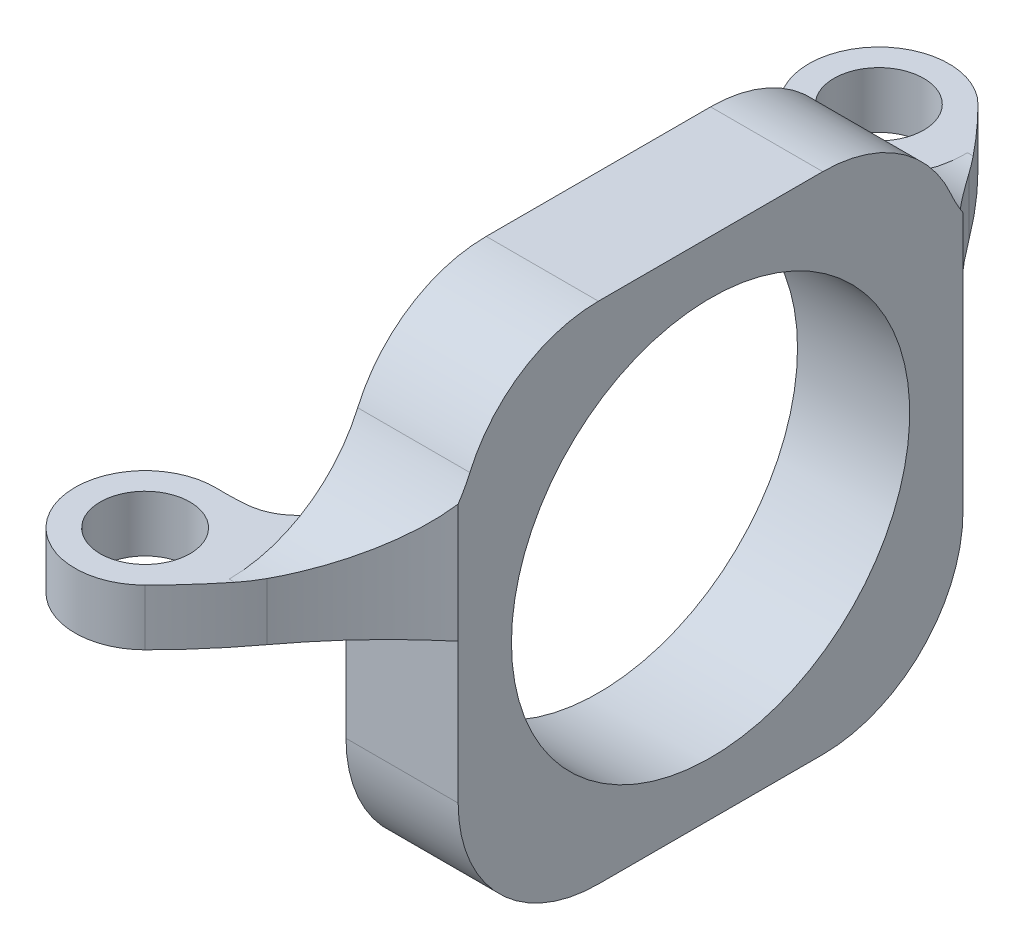
ISO-10303-21;
HEADER;
FILE_DESCRIPTION(('STEP AP214'),'2;1');
FILE_NAME('part.step','',(''),(''),'','','');
FILE_SCHEMA(('AUTOMOTIVE_DESIGN { 1 0 10303 214 1 1 1 1 }'));
ENDSEC;
DATA;
#1=APPLICATION_CONTEXT('core data for automotive mechanical design processes');
#2=APPLICATION_PROTOCOL_DEFINITION('international standard','automotive_design',2000,#1);
#3=PRODUCT_CONTEXT('',#1,'mechanical');
#4=PRODUCT('Part','Part','',(#3));
#5=PRODUCT_RELATED_PRODUCT_CATEGORY('part','',(#4));
#6=PRODUCT_DEFINITION_FORMATION('','',#4);
#7=PRODUCT_DEFINITION_CONTEXT('part definition',#1,'design');
#8=PRODUCT_DEFINITION('design','',#6,#7);
#9=PRODUCT_DEFINITION_SHAPE('','',#8);
#10=(LENGTH_UNIT() NAMED_UNIT(*) SI_UNIT(.MILLI.,.METRE.));
#11=(NAMED_UNIT(*) PLANE_ANGLE_UNIT() SI_UNIT($,.RADIAN.));
#12=(NAMED_UNIT(*) SI_UNIT($,.STERADIAN.) SOLID_ANGLE_UNIT());
#13=UNCERTAINTY_MEASURE_WITH_UNIT(LENGTH_MEASURE(1.E-05),#10,'distance_accuracy_value','');
#14=(GEOMETRIC_REPRESENTATION_CONTEXT(3) GLOBAL_UNCERTAINTY_ASSIGNED_CONTEXT((#13)) GLOBAL_UNIT_ASSIGNED_CONTEXT((#10,
#11,#12)) REPRESENTATION_CONTEXT('',''));
#15=CARTESIAN_POINT('',(0.,0.,0.));
#16=DIRECTION('',(0.,0.,1.));
#17=DIRECTION('',(1.,0.,0.));
#18=AXIS2_PLACEMENT_3D('',#15,#16,#17);
#19=CARTESIAN_POINT('',(0.,2.,8.99999999999999));
#20=DIRECTION('',(0.,0.,-1.));
#21=DIRECTION('',(-1.,0.,0.));
#22=AXIS2_PLACEMENT_3D('',#19,#20,#21);
#23=PLANE('',#22);
#24=DIRECTION('',(0.,-1.,0.));
#25=VECTOR('',#24,1.);
#26=CARTESIAN_POINT('',(20.1632298752446,2.,8.99999999999999));
#27=LINE('',#26,#25);
#28=CARTESIAN_POINT('',(20.1632298752446,0.,8.99999999999999));
#29=VERTEX_POINT('',#28);
#30=CARTESIAN_POINT('',(20.1632298752446,-5.,8.99999999999999));
#31=VERTEX_POINT('',#30);
#32=EDGE_CURVE('E274',#29,#31,#27,.T.);
#33=ORIENTED_EDGE('',*,*,#32,.F.);
#34=DIRECTION('',(1.,0.,0.));
#35=VECTOR('',#34,1.);
#36=CARTESIAN_POINT('',(0.,0.,8.99999999999999));
#37=LINE('',#36,#35);
#38=CARTESIAN_POINT('',(16.1632298752446,0.,8.99999999999999));
#39=VERTEX_POINT('',#38);
#40=EDGE_CURVE('E302',#39,#29,#37,.T.);
#41=ORIENTED_EDGE('',*,*,#40,.F.);
#42=DIRECTION('',(0.,1.,0.));
#43=VECTOR('',#42,1.);
#44=CARTESIAN_POINT('',(16.1632298752446,-10.,8.99999999999999));
#45=LINE('',#44,#43);
#46=CARTESIAN_POINT('',(16.1632298752446,-5.,8.99999999999999));
#47=VERTEX_POINT('',#46);
#48=EDGE_CURVE('E278',#47,#39,#45,.T.);
#49=ORIENTED_EDGE('',*,*,#48,.F.);
#50=DIRECTION('',(1.,0.,0.));
#51=VECTOR('',#50,1.);
#52=CARTESIAN_POINT('',(20.1632298752446,-5.,8.99999999999999));
#53=LINE('',#52,#51);
#54=EDGE_CURVE('E347',#47,#31,#53,.T.);
#55=ORIENTED_EDGE('',*,*,#54,.T.);
#56=EDGE_LOOP('',(#33,#41,#49,#55));
#57=FACE_BOUND('',#56,.T.);
#58=ADVANCED_FACE('F47',(#57),#23,.F.);
#59=CARTESIAN_POINT('',(0.,2.,-9.00000000000001));
#60=DIRECTION('',(0.,0.,-1.));
#61=DIRECTION('',(-1.,0.,0.));
#62=AXIS2_PLACEMENT_3D('',#59,#60,#61);
#63=PLANE('',#62);
#64=DIRECTION('',(-1.,0.,0.));
#65=VECTOR('',#64,1.);
#66=CARTESIAN_POINT('',(0.,0.,-9.00000000000001));
#67=LINE('',#66,#65);
#68=CARTESIAN_POINT('',(20.1632298752446,0.,-9.00000000000001));
#69=VERTEX_POINT('',#68);
#70=CARTESIAN_POINT('',(16.1632298752446,0.,-9.00000000000001));
#71=VERTEX_POINT('',#70);
#72=EDGE_CURVE('E298',#69,#71,#67,.T.);
#73=ORIENTED_EDGE('',*,*,#72,.F.);
#74=DIRECTION('',(0.,-1.,0.));
#75=VECTOR('',#74,1.);
#76=CARTESIAN_POINT('',(20.1632298752446,2.,-9.00000000000001));
#77=LINE('',#76,#75);
#78=CARTESIAN_POINT('',(20.1632298752446,-5.,-9.00000000000001));
#79=VERTEX_POINT('',#78);
#80=EDGE_CURVE('E242',#69,#79,#77,.T.);
#81=ORIENTED_EDGE('',*,*,#80,.T.);
#82=DIRECTION('',(-1.,0.,0.));
#83=VECTOR('',#82,1.);
#84=CARTESIAN_POINT('',(0.,-5.,-9.00000000000001));
#85=LINE('',#84,#83);
#86=CARTESIAN_POINT('',(16.1632298752446,-5.,-9.00000000000001));
#87=VERTEX_POINT('',#86);
#88=EDGE_CURVE('E305',#79,#87,#85,.T.);
#89=ORIENTED_EDGE('',*,*,#88,.T.);
#90=DIRECTION('',(0.,1.,0.));
#91=VECTOR('',#90,1.);
#92=CARTESIAN_POINT('',(16.1632298752446,-10.,-9.00000000000001));
#93=LINE('',#92,#91);
#94=EDGE_CURVE('E257',#87,#71,#93,.T.);
#95=ORIENTED_EDGE('',*,*,#94,.T.);
#96=EDGE_LOOP('',(#73,#81,#89,#95));
#97=FACE_BOUND('',#96,.T.);
#98=ADVANCED_FACE('F494',(#97),#63,.T.);
#99=CARTESIAN_POINT('',(0.,2.,0.));
#100=DIRECTION('',(0.,1.,0.));
#101=DIRECTION('',(0.,0.,1.));
#102=AXIS2_PLACEMENT_3D('',#99,#100,#101);
#103=PLANE('',#102);
#104=CARTESIAN_POINT('',(0.,2.,0.));
#105=DIRECTION('',(0.,1.,0.));
#106=DIRECTION('',(0.,0.,1.));
#107=AXIS2_PLACEMENT_3D('',#104,#105,#106);
#108=CIRCLE('',#107,21.);
#109=CARTESIAN_POINT('',(14.8492424049175,2.,14.8492424049175));
#110=VERTEX_POINT('',#109);
#111=CARTESIAN_POINT('',(16.3608920563858,2.,13.1651513899117));
#112=VERTEX_POINT('',#111);
#113=EDGE_CURVE('E262',#110,#112,#108,.T.);
#114=ORIENTED_EDGE('',*,*,#113,.T.);
#115=DIRECTION('',(-1.,0.,0.));
#116=VECTOR('',#115,1.);
#117=CARTESIAN_POINT('',(16.1632298752446,2.,13.1651513899117));
#118=LINE('',#117,#116);
#119=CARTESIAN_POINT('',(16.1632298752446,2.,13.1651513899117));
#120=VERTEX_POINT('',#119);
#121=EDGE_CURVE('E462',#112,#120,#118,.T.);
#122=ORIENTED_EDGE('',*,*,#121,.T.);
#123=DIRECTION('',(0.,0.,1.));
#124=VECTOR('',#123,1.);
#125=CARTESIAN_POINT('',(16.1632298752446,2.,0.));
#126=LINE('',#125,#124);
#127=CARTESIAN_POINT('',(16.1632298752446,2.,7.5915939533438));
#128=VERTEX_POINT('',#127);
#129=EDGE_CURVE('E382',#128,#120,#126,.T.);
#130=ORIENTED_EDGE('',*,*,#129,.F.);
#131=CARTESIAN_POINT('',(11.1632298752446,2.,7.5915939533438));
#132=DIRECTION('',(0.,1.,0.));
#133=DIRECTION('',(0.,0.,1.));
#134=AXIS2_PLACEMENT_3D('',#131,#132,#133);
#135=CIRCLE('',#134,5.);
#136=CARTESIAN_POINT('',(15.8940619925328,2.,9.2099967085425));
#137=VERTEX_POINT('',#136);
#138=EDGE_CURVE('E396',#128,#137,#135,.F.);
#139=ORIENTED_EDGE('',*,*,#138,.T.);
#140=CARTESIAN_POINT('',(14.0017291456175,2.,8.56263560646302));
#141=DIRECTION('',(0.,1.,0.));
#142=DIRECTION('',(0.,0.,1.));
#143=AXIS2_PLACEMENT_3D('',#140,#141,#142);
#144=CIRCLE('',#143,2.);
#145=CARTESIAN_POINT('',(14.1527478438893,2.,10.556925794167));
#146=VERTEX_POINT('',#145);
#147=EDGE_CURVE('E443',#137,#146,#144,.F.);
#148=ORIENTED_EDGE('',*,*,#147,.T.);
#149=CARTESIAN_POINT('',(13.3976543525304,2.,0.585474855647181));
#150=DIRECTION('',(0.,1.,0.));
#151=DIRECTION('',(0.,0.,1.));
#152=AXIS2_PLACEMENT_3D('',#149,#150,#151);
#153=CIRCLE('',#152,10.);
#154=CARTESIAN_POINT('',(13.144711232067,2.,10.5822753326903));
#155=VERTEX_POINT('',#154);
#156=EDGE_CURVE('E417',#146,#155,#153,.F.);
#157=ORIENTED_EDGE('',*,*,#156,.T.);
#158=CARTESIAN_POINT('',(13.0814754519511,2.,13.0814754519511));
#159=DIRECTION('',(0.,1.,0.));
#160=DIRECTION('',(0.,0.,1.));
#161=AXIS2_PLACEMENT_3D('',#158,#159,#160);
#162=CIRCLE('',#161,2.5);
#163=EDGE_CURVE('E230',#155,#110,#162,.T.);
#164=ORIENTED_EDGE('',*,*,#163,.T.);
#165=EDGE_LOOP('',(#114,#122,#130,#139,#148,#157,#164));
#166=FACE_BOUND('',#165,.T.);
#167=CARTESIAN_POINT('',(13.0814754519511,2.,13.0814754519511));
#168=DIRECTION('',(0.,1.,0.));
#169=DIRECTION('',(0.,0.,1.));
#170=AXIS2_PLACEMENT_3D('',#167,#168,#169);
#171=CIRCLE('',#170,1.6);
#172=CARTESIAN_POINT('',(13.0814754519511,2.,14.6814754519511));
#173=VERTEX_POINT('',#172);
#174=EDGE_CURVE('E266',#173,#173,#171,.T.);
#175=ORIENTED_EDGE('',*,*,#174,.F.);
#176=EDGE_LOOP('',(#175));
#177=FACE_BOUND('',#176,.T.);
#178=ADVANCED_FACE('F497',(#166,#177),#103,.T.);
#179=CARTESIAN_POINT('',(0.,0.,0.));
#180=DIRECTION('',(0.,1.,0.));
#181=DIRECTION('',(0.,0.,1.));
#182=AXIS2_PLACEMENT_3D('',#179,#180,#181);
#183=PLANE('',#182);
#184=CARTESIAN_POINT('',(13.0814754519511,0.,13.0814754519511));
#185=DIRECTION('',(0.,1.,0.));
#186=DIRECTION('',(0.,0.,1.));
#187=AXIS2_PLACEMENT_3D('',#184,#185,#186);
#188=CIRCLE('',#187,1.6);
#189=CARTESIAN_POINT('',(13.0814754519511,0.,14.6814754519511));
#190=VERTEX_POINT('',#189);
#191=EDGE_CURVE('E254',#190,#190,#188,.T.);
#192=ORIENTED_EDGE('',*,*,#191,.T.);
#193=EDGE_LOOP('',(#192));
#194=FACE_BOUND('',#193,.T.);
#195=CARTESIAN_POINT('',(13.0814754519511,0.,13.0814754519511));
#196=DIRECTION('',(0.,1.,0.));
#197=DIRECTION('',(0.,0.,1.));
#198=AXIS2_PLACEMENT_3D('',#195,#196,#197);
#199=CIRCLE('',#198,2.5);
#200=CARTESIAN_POINT('',(13.144711232067,0.,10.5822753326903));
#201=VERTEX_POINT('',#200);
#202=CARTESIAN_POINT('',(14.8492424049175,0.,14.8492424049175));
#203=VERTEX_POINT('',#202);
#204=EDGE_CURVE('E281',#201,#203,#199,.T.);
#205=ORIENTED_EDGE('',*,*,#204,.F.);
#206=CARTESIAN_POINT('',(13.3976543525304,0.,0.585474855647181));
#207=DIRECTION('',(0.,1.,0.));
#208=DIRECTION('',(0.,0.,1.));
#209=AXIS2_PLACEMENT_3D('',#206,#207,#208);
#210=CIRCLE('',#209,10.);
#211=CARTESIAN_POINT('',(14.1527478438893,0.,10.556925794167));
#212=VERTEX_POINT('',#211);
#213=EDGE_CURVE('E413',#201,#212,#210,.T.);
#214=ORIENTED_EDGE('',*,*,#213,.T.);
#215=CARTESIAN_POINT('',(14.0017291456175,0.,8.56263560646302));
#216=DIRECTION('',(0.,1.,0.));
#217=DIRECTION('',(0.,0.,1.));
#218=AXIS2_PLACEMENT_3D('',#215,#216,#217);
#219=CIRCLE('',#218,2.);
#220=CARTESIAN_POINT('',(15.8940619925328,0.,9.2099967085425));
#221=VERTEX_POINT('',#220);
#222=EDGE_CURVE('E440',#212,#221,#219,.T.);
#223=ORIENTED_EDGE('',*,*,#222,.T.);
#224=CARTESIAN_POINT('',(11.1632298752446,0.,7.5915939533438));
#225=DIRECTION('',(0.,1.,0.));
#226=DIRECTION('',(0.,0.,1.));
#227=AXIS2_PLACEMENT_3D('',#224,#225,#226);
#228=CIRCLE('',#227,5.);
#229=CARTESIAN_POINT('',(16.1632298752446,0.,7.5915939533438));
#230=VERTEX_POINT('',#229);
#231=EDGE_CURVE('E393',#221,#230,#228,.T.);
#232=ORIENTED_EDGE('',*,*,#231,.T.);
#233=DIRECTION('',(0.,0.,-1.));
#234=VECTOR('',#233,1.);
#235=CARTESIAN_POINT('',(16.1632298752446,0.,0.));
#236=LINE('',#235,#234);
#237=EDGE_CURVE('E389',#39,#230,#236,.T.);
#238=ORIENTED_EDGE('',*,*,#237,.F.);
#239=ORIENTED_EDGE('',*,*,#40,.T.);
#240=CARTESIAN_POINT('',(33.7226109756454,0.,25.0356847117326));
#241=DIRECTION('',(0.,1.,0.));
#242=DIRECTION('',(0.,0.,1.));
#243=AXIS2_PLACEMENT_3D('',#240,#241,#242);
#244=CIRCLE('',#243,21.);
#245=CARTESIAN_POINT('',(16.8613054878227,0.,12.5178423558663));
#246=VERTEX_POINT('',#245);
#247=EDGE_CURVE('E368',#29,#246,#244,.T.);
#248=ORIENTED_EDGE('',*,*,#247,.T.);
#249=CARTESIAN_POINT('',(0.,0.,0.));
#250=DIRECTION('',(0.,1.,0.));
#251=DIRECTION('',(0.,0.,1.));
#252=AXIS2_PLACEMENT_3D('',#249,#250,#251);
#253=CIRCLE('',#252,21.);
#254=EDGE_CURVE('E284',#203,#246,#253,.T.);
#255=ORIENTED_EDGE('',*,*,#254,.F.);
#256=EDGE_LOOP('',(#205,#214,#223,#232,#238,#239,#248,#255));
#257=FACE_BOUND('',#256,.T.);
#258=ADVANCED_FACE('F492',(#194,#257),#183,.F.);
#259=CARTESIAN_POINT('',(0.,2.,0.));
#260=DIRECTION('',(0.,-1.,0.));
#261=DIRECTION('',(0.,0.,-1.));
#262=AXIS2_PLACEMENT_3D('',#259,#260,#261);
#263=CYLINDRICAL_SURFACE('',#262,21.);
#264=CARTESIAN_POINT('',(0.,2.,0.));
#265=DIRECTION('',(0.,1.,0.));
#266=DIRECTION('',(0.,0.,1.));
#267=AXIS2_PLACEMENT_3D('',#264,#265,#266);
#268=CIRCLE('',#267,21.);
#269=CARTESIAN_POINT('',(14.8492424049175,2.,-14.8492424049175));
#270=VERTEX_POINT('',#269);
#271=CARTESIAN_POINT('',(16.3608920563857,2.,-13.1651513899117));
#272=VERTEX_POINT('',#271);
#273=EDGE_CURVE('E231',#270,#272,#268,.F.);
#274=ORIENTED_EDGE('',*,*,#273,.T.);
#275=CARTESIAN_POINT('',(16.3608920563857,2.,-13.1651513899117));
#276=CARTESIAN_POINT('',(16.4037309745653,2.00000007852321,-13.1119141365129));
#277=CARTESIAN_POINT('',(16.4463102428086,2.00085027696003,-13.0584665663315));
#278=CARTESIAN_POINT('',(16.5308853952596,2.00429030590994,-12.9512348517216));
#279=CARTESIAN_POINT('',(16.5728817062718,2.00687878683591,-12.8974510004477));
#280=CARTESIAN_POINT('',(16.6562937386516,2.01383467620823,-12.7895476418713));
#281=CARTESIAN_POINT('',(16.6977094552945,2.01820209912243,-12.7354281318426));
#282=CARTESIAN_POINT('',(16.7799599052771,2.02876080415639,-12.6268598996597));
#283=CARTESIAN_POINT('',(16.820794162765,2.03495349915541,-12.5724109546002));
#284=CARTESIAN_POINT('',(16.8613054878227,2.04207795397677,-12.5178423558663));
#285=B_SPLINE_CURVE_WITH_KNOTS('',3,(#275,#276,#277,#278,#279,#280,#281,#282,#283,#284),
.UNSPECIFIED.,.F.,.F.,(4,2,2,2,4),(0.,0.204993994830634,0.409829017862656,0.6146657068175,
0.81966137096516),.UNSPECIFIED.);
#286=CARTESIAN_POINT('',(16.8613054878227,2.04207795397677,-12.5178423558663));
#287=VERTEX_POINT('',#286);
#288=EDGE_CURVE('E470',#272,#287,#285,.T.);
#289=ORIENTED_EDGE('',*,*,#288,.T.);
#290=DIRECTION('',(0.,-1.,0.));
#291=VECTOR('',#290,1.);
#292=CARTESIAN_POINT('',(16.8613054878227,2.,-12.5178423558663));
#293=LINE('',#292,#291);
#294=CARTESIAN_POINT('',(16.8613054878227,0.,-12.5178423558663));
#295=VERTEX_POINT('',#294);
#296=EDGE_CURVE('E359',#287,#295,#293,.T.);
#297=ORIENTED_EDGE('',*,*,#296,.T.);
#298=CARTESIAN_POINT('',(0.,0.,0.));
#299=DIRECTION('',(0.,1.,0.));
#300=DIRECTION('',(0.,0.,1.));
#301=AXIS2_PLACEMENT_3D('',#298,#299,#300);
#302=CIRCLE('',#301,21.);
#303=CARTESIAN_POINT('',(14.8492424049175,0.,-14.8492424049175));
#304=VERTEX_POINT('',#303);
#305=EDGE_CURVE('E240',#304,#295,#302,.F.);
#306=ORIENTED_EDGE('',*,*,#305,.F.);
#307=DIRECTION('',(0.,-1.,0.));
#308=VECTOR('',#307,1.);
#309=CARTESIAN_POINT('',(14.8492424049175,2.,-14.8492424049175));
#310=LINE('',#309,#308);
#311=EDGE_CURVE('E221',#270,#304,#310,.T.);
#312=ORIENTED_EDGE('',*,*,#311,.F.);
#313=EDGE_LOOP('',(#274,#289,#297,#306,#312));
#314=FACE_BOUND('',#313,.T.);
#315=ADVANCED_FACE('F235',(#314),#263,.T.);
#316=CARTESIAN_POINT('',(13.0814754519511,2.,-13.0814754519511));
#317=DIRECTION('',(0.,-1.,0.));
#318=DIRECTION('',(0.,0.,-1.));
#319=AXIS2_PLACEMENT_3D('',#316,#317,#318);
#320=CYLINDRICAL_SURFACE('',#319,2.5);
#321=CARTESIAN_POINT('',(13.0814754519511,0.,-13.0814754519511));
#322=DIRECTION('',(0.,1.,0.));
#323=DIRECTION('',(0.,0.,1.));
#324=AXIS2_PLACEMENT_3D('',#321,#322,#323);
#325=CIRCLE('',#324,2.5);
#326=CARTESIAN_POINT('',(13.144711232067,0.,-10.5822753326903));
#327=VERTEX_POINT('',#326);
#328=EDGE_CURVE('E277',#327,#304,#325,.F.);
#329=ORIENTED_EDGE('',*,*,#328,.F.);
#330=DIRECTION('',(0.,-1.,0.));
#331=VECTOR('',#330,1.);
#332=CARTESIAN_POINT('',(13.144711232067,2.,-10.5822753326903));
#333=LINE('',#332,#331);
#334=CARTESIAN_POINT('',(13.144711232067,2.,-10.5822753326903));
#335=VERTEX_POINT('',#334);
#336=EDGE_CURVE('E224',#327,#335,#333,.F.);
#337=ORIENTED_EDGE('',*,*,#336,.T.);
#338=CARTESIAN_POINT('',(13.0814754519511,2.,-13.0814754519511));
#339=DIRECTION('',(0.,1.,0.));
#340=DIRECTION('',(0.,0.,1.));
#341=AXIS2_PLACEMENT_3D('',#338,#339,#340);
#342=CIRCLE('',#341,2.5);
#343=EDGE_CURVE('E217',#335,#270,#342,.F.);
#344=ORIENTED_EDGE('',*,*,#343,.T.);
#345=ORIENTED_EDGE('',*,*,#311,.T.);
#346=EDGE_LOOP('',(#329,#337,#344,#345));
#347=FACE_BOUND('',#346,.T.);
#348=ADVANCED_FACE('F220',(#347),#320,.T.);
#349=CARTESIAN_POINT('',(16.1632298752446,2.,0.));
#350=DIRECTION('',(1.,0.,0.));
#351=DIRECTION('',(0.,0.,-1.));
#352=AXIS2_PLACEMENT_3D('',#349,#350,#351);
#353=PLANE('',#352);
#354=CARTESIAN_POINT('',(16.1632298752446,-1.,0.));
#355=DIRECTION('',(1.,0.,0.));
#356=DIRECTION('',(0.,0.,-1.));
#357=AXIS2_PLACEMENT_3D('',#354,#355,#356);
#358=CIRCLE('',#357,7.1);
#359=CARTESIAN_POINT('',(16.1632298752446,-1.,-7.1));
#360=VERTEX_POINT('',#359);
#361=EDGE_CURVE('E310',#360,#360,#358,.F.);
#362=ORIENTED_EDGE('',*,*,#361,.F.);
#363=EDGE_LOOP('',(#362));
#364=FACE_BOUND('',#363,.T.);
#365=ORIENTED_EDGE('',*,*,#48,.T.);
#366=ORIENTED_EDGE('',*,*,#237,.T.);
#367=DIRECTION('',(0.,1.,0.));
#368=VECTOR('',#367,1.);
#369=CARTESIAN_POINT('',(16.1632298752446,2.,7.5915939533438));
#370=LINE('',#369,#368);
#371=EDGE_CURVE('E385',#230,#128,#370,.T.);
#372=ORIENTED_EDGE('',*,*,#371,.T.);
#373=ORIENTED_EDGE('',*,*,#129,.T.);
#374=CARTESIAN_POINT('',(16.1632298752446,7.,13.1651513899117));
#375=DIRECTION('',(1.,0.,0.));
#376=DIRECTION('',(0.,0.,-1.));
#377=AXIS2_PLACEMENT_3D('',#374,#375,#376);
#378=CIRCLE('',#377,5.);
#379=CARTESIAN_POINT('',(16.1632298752446,5.,8.58257569495583));
#380=VERTEX_POINT('',#379);
#381=EDGE_CURVE('E11',#120,#380,#378,.T.);
#382=ORIENTED_EDGE('',*,*,#381,.T.);
#383=CARTESIAN_POINT('',(16.1632298752446,3.,3.99999999999999));
#384=DIRECTION('',(1.,0.,0.));
#385=DIRECTION('',(0.,0.,-1.));
#386=AXIS2_PLACEMENT_3D('',#383,#384,#385);
#387=CIRCLE('',#386,5.);
#388=CARTESIAN_POINT('',(16.1632298752446,8.,3.99999999999999));
#389=VERTEX_POINT('',#388);
#390=EDGE_CURVE('E314',#380,#389,#387,.F.);
#391=ORIENTED_EDGE('',*,*,#390,.T.);
#392=DIRECTION('',(0.,0.,1.));
#393=VECTOR('',#392,1.);
#394=CARTESIAN_POINT('',(16.1632298752446,8.,-9.00000000000001));
#395=LINE('',#394,#393);
#396=CARTESIAN_POINT('',(16.1632298752446,8.,-4.));
#397=VERTEX_POINT('',#396);
#398=EDGE_CURVE('E593',#397,#389,#395,.T.);
#399=ORIENTED_EDGE('',*,*,#398,.F.);
#400=CARTESIAN_POINT('',(16.1632298752446,3.,-4.));
#401=DIRECTION('',(1.,0.,0.));
#402=DIRECTION('',(0.,0.,-1.));
#403=AXIS2_PLACEMENT_3D('',#400,#401,#402);
#404=CIRCLE('',#403,5.);
#405=CARTESIAN_POINT('',(16.1632298752446,5.,-8.58257569495584));
#406=VERTEX_POINT('',#405);
#407=EDGE_CURVE('E317',#397,#406,#404,.F.);
#408=ORIENTED_EDGE('',*,*,#407,.T.);
#409=CARTESIAN_POINT('',(16.1632298752446,7.,-13.1651513899117));
#410=DIRECTION('',(1.,0.,0.));
#411=DIRECTION('',(0.,0.,-1.));
#412=AXIS2_PLACEMENT_3D('',#409,#410,#411);
#413=CIRCLE('',#412,5.);
#414=CARTESIAN_POINT('',(16.1632298752446,2.,-13.1651513899117));
#415=VERTEX_POINT('',#414);
#416=EDGE_CURVE('E466',#406,#415,#413,.T.);
#417=ORIENTED_EDGE('',*,*,#416,.T.);
#418=DIRECTION('',(0.,0.,1.));
#419=VECTOR('',#418,1.);
#420=CARTESIAN_POINT('',(16.1632298752446,2.,0.));
#421=LINE('',#420,#419);
#422=CARTESIAN_POINT('',(16.1632298752446,2.,-7.5915939533438));
#423=VERTEX_POINT('',#422);
#424=EDGE_CURVE('E371',#415,#423,#421,.T.);
#425=ORIENTED_EDGE('',*,*,#424,.T.);
#426=DIRECTION('',(0.,1.,0.));
#427=VECTOR('',#426,1.);
#428=CARTESIAN_POINT('',(16.1632298752446,0.,-7.5915939533438));
#429=LINE('',#428,#427);
#430=CARTESIAN_POINT('',(16.1632298752446,0.,-7.5915939533438));
#431=VERTEX_POINT('',#430);
#432=EDGE_CURVE('E375',#423,#431,#429,.F.);
#433=ORIENTED_EDGE('',*,*,#432,.T.);
#434=DIRECTION('',(0.,0.,-1.));
#435=VECTOR('',#434,1.);
#436=CARTESIAN_POINT('',(16.1632298752446,0.,0.));
#437=LINE('',#436,#435);
#438=EDGE_CURVE('E379',#431,#71,#437,.T.);
#439=ORIENTED_EDGE('',*,*,#438,.T.);
#440=ORIENTED_EDGE('',*,*,#94,.F.);
#441=CARTESIAN_POINT('',(16.1632298752446,-5.,-4.));
#442=DIRECTION('',(1.,0.,0.));
#443=DIRECTION('',(0.,0.,-1.));
#444=AXIS2_PLACEMENT_3D('',#441,#442,#443);
#445=CIRCLE('',#444,5.);
#446=CARTESIAN_POINT('',(16.1632298752446,-10.,-4.));
#447=VERTEX_POINT('',#446);
#448=EDGE_CURVE('E324',#87,#447,#445,.F.);
#449=ORIENTED_EDGE('',*,*,#448,.T.);
#450=DIRECTION('',(0.,0.,1.));
#451=VECTOR('',#450,1.);
#452=CARTESIAN_POINT('',(16.1632298752446,-10.,-9.00000000000001));
#453=LINE('',#452,#451);
#454=CARTESIAN_POINT('',(16.1632298752446,-10.,3.99999999999999));
#455=VERTEX_POINT('',#454);
#456=EDGE_CURVE('E609',#447,#455,#453,.T.);
#457=ORIENTED_EDGE('',*,*,#456,.T.);
#458=CARTESIAN_POINT('',(16.1632298752446,-5.,3.99999999999999));
#459=DIRECTION('',(1.,0.,0.));
#460=DIRECTION('',(0.,0.,-1.));
#461=AXIS2_PLACEMENT_3D('',#458,#459,#460);
#462=CIRCLE('',#461,5.);
#463=EDGE_CURVE('E321',#455,#47,#462,.F.);
#464=ORIENTED_EDGE('',*,*,#463,.T.);
#465=EDGE_LOOP('',(#365,#366,#372,#373,#382,#391,#399,#408,#417,#425,#433,#439,#440,#449,#457,#464));
#466=FACE_BOUND('',#465,.T.);
#467=ADVANCED_FACE('F550',(#364,#466),#353,.F.);
#468=CARTESIAN_POINT('',(13.0814754519511,2.,13.0814754519511));
#469=DIRECTION('',(0.,-1.,0.));
#470=DIRECTION('',(0.,0.,-1.));
#471=AXIS2_PLACEMENT_3D('',#468,#469,#470);
#472=CYLINDRICAL_SURFACE('',#471,2.5);
#473=ORIENTED_EDGE('',*,*,#163,.F.);
#474=DIRECTION('',(0.,-1.,0.));
#475=VECTOR('',#474,1.);
#476=CARTESIAN_POINT('',(13.144711232067,2.,10.5822753326903));
#477=LINE('',#476,#475);
#478=EDGE_CURVE('E407',#155,#201,#477,.T.);
#479=ORIENTED_EDGE('',*,*,#478,.T.);
#480=ORIENTED_EDGE('',*,*,#204,.T.);
#481=DIRECTION('',(0.,-1.,0.));
#482=VECTOR('',#481,1.);
#483=CARTESIAN_POINT('',(14.8492424049175,2.,14.8492424049175));
#484=LINE('',#483,#482);
#485=EDGE_CURVE('E243',#110,#203,#484,.T.);
#486=ORIENTED_EDGE('',*,*,#485,.F.);
#487=EDGE_LOOP('',(#473,#479,#480,#486));
#488=FACE_BOUND('',#487,.T.);
#489=ADVANCED_FACE('F547',(#488),#472,.T.);
#490=CARTESIAN_POINT('',(0.,2.,0.));
#491=DIRECTION('',(0.,-1.,0.));
#492=DIRECTION('',(0.,0.,-1.));
#493=AXIS2_PLACEMENT_3D('',#490,#491,#492);
#494=CYLINDRICAL_SURFACE('',#493,21.);
#495=ORIENTED_EDGE('',*,*,#254,.T.);
#496=DIRECTION('',(0.,-1.,0.));
#497=VECTOR('',#496,1.);
#498=CARTESIAN_POINT('',(16.8613054878227,2.,12.5178423558663));
#499=LINE('',#498,#497);
#500=CARTESIAN_POINT('',(16.8613054878227,2.04207795397677,12.5178423558663));
#501=VERTEX_POINT('',#500);
#502=EDGE_CURVE('E72',#246,#501,#499,.F.);
#503=ORIENTED_EDGE('',*,*,#502,.T.);
#504=CARTESIAN_POINT('',(16.8613054878227,2.04207795397677,12.5178423558663));
#505=CARTESIAN_POINT('',(16.820794162765,2.03495349915541,12.5724109546002));
#506=CARTESIAN_POINT('',(16.7799599052771,2.02876080415639,12.6268598996597));
#507=CARTESIAN_POINT('',(16.6977094552945,2.01820209912243,12.7354281318426));
#508=CARTESIAN_POINT('',(16.6562937386516,2.01383467620823,12.7895476418713));
#509=CARTESIAN_POINT('',(16.5728817062718,2.00687878683591,12.8974510004477));
#510=CARTESIAN_POINT('',(16.5308853952596,2.00429030590994,12.9512348517216));
#511=CARTESIAN_POINT('',(16.4463102428086,2.00085027696003,13.0584665663315));
#512=CARTESIAN_POINT('',(16.4037309745653,2.00000007852321,13.1119141365129));
#513=CARTESIAN_POINT('',(16.3608920563858,2.,13.1651513899117));
#514=B_SPLINE_CURVE_WITH_KNOTS('',3,(#504,#505,#506,#507,#508,#509,#510,#511,#512,#513),
.UNSPECIFIED.,.F.,.F.,(4,2,2,2,4),(0.,0.204995664147657,0.409832353102499,0.614667376134519,
0.819661370965151),.UNSPECIFIED.);
#515=EDGE_CURVE('E57',#501,#112,#514,.T.);
#516=ORIENTED_EDGE('',*,*,#515,.T.);
#517=ORIENTED_EDGE('',*,*,#113,.F.);
#518=ORIENTED_EDGE('',*,*,#485,.T.);
#519=EDGE_LOOP('',(#495,#503,#516,#517,#518));
#520=FACE_BOUND('',#519,.T.);
#521=ADVANCED_FACE('F541',(#520),#494,.T.);
#522=CARTESIAN_POINT('',(13.0814754519511,2.,13.0814754519511));
#523=DIRECTION('',(0.,-1.,0.));
#524=DIRECTION('',(0.,0.,-1.));
#525=AXIS2_PLACEMENT_3D('',#522,#523,#524);
#526=CYLINDRICAL_SURFACE('',#525,1.6);
#527=ORIENTED_EDGE('',*,*,#174,.T.);
#528=EDGE_LOOP('',(#527));
#529=FACE_BOUND('',#528,.T.);
#530=ORIENTED_EDGE('',*,*,#191,.F.);
#531=EDGE_LOOP('',(#530));
#532=FACE_BOUND('',#531,.T.);
#533=ADVANCED_FACE('F546',(#529,#532),#526,.F.);
#534=CARTESIAN_POINT('',(20.1632298752446,2.,0.));
#535=DIRECTION('',(-1.,0.,0.));
#536=DIRECTION('',(0.,0.,1.));
#537=AXIS2_PLACEMENT_3D('',#534,#535,#536);
#538=PLANE('',#537);
#539=CARTESIAN_POINT('',(20.1632298752446,-1.,0.));
#540=DIRECTION('',(-1.,0.,0.));
#541=DIRECTION('',(0.,0.,1.));
#542=AXIS2_PLACEMENT_3D('',#539,#540,#541);
#543=CIRCLE('',#542,7.1);
#544=CARTESIAN_POINT('',(20.1632298752446,-1.,7.1));
#545=VERTEX_POINT('',#544);
#546=EDGE_CURVE('E306',#545,#545,#543,.F.);
#547=ORIENTED_EDGE('',*,*,#546,.F.);
#548=EDGE_LOOP('',(#547));
#549=FACE_BOUND('',#548,.T.);
#550=DIRECTION('',(0.,0.,-1.));
#551=VECTOR('',#550,1.);
#552=CARTESIAN_POINT('',(20.1632298752446,-10.,-9.00000000000001));
#553=LINE('',#552,#551);
#554=CARTESIAN_POINT('',(20.1632298752446,-10.,3.99999999999999));
#555=VERTEX_POINT('',#554);
#556=CARTESIAN_POINT('',(20.1632298752446,-10.,-4.));
#557=VERTEX_POINT('',#556);
#558=EDGE_CURVE('E602',#555,#557,#553,.T.);
#559=ORIENTED_EDGE('',*,*,#558,.T.);
#560=CARTESIAN_POINT('',(20.1632298752446,-5.,-4.));
#561=DIRECTION('',(-1.,0.,0.));
#562=DIRECTION('',(0.,0.,1.));
#563=AXIS2_PLACEMENT_3D('',#560,#561,#562);
#564=CIRCLE('',#563,5.);
#565=EDGE_CURVE('E343',#557,#79,#564,.F.);
#566=ORIENTED_EDGE('',*,*,#565,.T.);
#567=ORIENTED_EDGE('',*,*,#80,.F.);
#568=CARTESIAN_POINT('',(20.1632298752446,4.23386300065923,-9.00000000000001));
#569=VERTEX_POINT('',#568);
#570=EDGE_CURVE('E297',#569,#69,#77,.T.);
#571=ORIENTED_EDGE('',*,*,#570,.F.);
#572=CARTESIAN_POINT('',(20.1632298752446,7.,-13.1651513899117));
#573=DIRECTION('',(-1.,0.,0.));
#574=DIRECTION('',(0.,0.,1.));
#575=AXIS2_PLACEMENT_3D('',#572,#573,#574);
#576=CIRCLE('',#575,5.);
#577=CARTESIAN_POINT('',(20.1632298752446,5.,-8.58257569495584));
#578=VERTEX_POINT('',#577);
#579=EDGE_CURVE('E578',#569,#578,#576,.T.);
#580=ORIENTED_EDGE('',*,*,#579,.T.);
#581=CARTESIAN_POINT('',(20.1632298752446,3.,-4.));
#582=DIRECTION('',(-1.,0.,0.));
#583=DIRECTION('',(0.,0.,1.));
#584=AXIS2_PLACEMENT_3D('',#581,#582,#583);
#585=CIRCLE('',#584,5.);
#586=CARTESIAN_POINT('',(20.1632298752446,8.,-4.));
#587=VERTEX_POINT('',#586);
#588=EDGE_CURVE('E337',#578,#587,#585,.F.);
#589=ORIENTED_EDGE('',*,*,#588,.T.);
#590=DIRECTION('',(0.,0.,-1.));
#591=VECTOR('',#590,1.);
#592=CARTESIAN_POINT('',(20.1632298752446,8.,-9.00000000000001));
#593=LINE('',#592,#591);
#594=CARTESIAN_POINT('',(20.1632298752446,8.,3.99999999999999));
#595=VERTEX_POINT('',#594);
#596=EDGE_CURVE('E597',#595,#587,#593,.T.);
#597=ORIENTED_EDGE('',*,*,#596,.F.);
#598=CARTESIAN_POINT('',(20.1632298752446,3.,3.99999999999999));
#599=DIRECTION('',(-1.,0.,0.));
#600=DIRECTION('',(0.,0.,1.));
#601=AXIS2_PLACEMENT_3D('',#598,#599,#600);
#602=CIRCLE('',#601,5.);
#603=CARTESIAN_POINT('',(20.1632298752446,5.,8.58257569495583));
#604=VERTEX_POINT('',#603);
#605=EDGE_CURVE('E333',#595,#604,#602,.F.);
#606=ORIENTED_EDGE('',*,*,#605,.T.);
#607=CARTESIAN_POINT('',(20.1632298752446,7.,13.1651513899117));
#608=DIRECTION('',(-1.,0.,0.));
#609=DIRECTION('',(0.,0.,1.));
#610=AXIS2_PLACEMENT_3D('',#607,#608,#609);
#611=CIRCLE('',#610,5.);
#612=CARTESIAN_POINT('',(20.1632298752446,4.23386300065923,8.99999999999999));
#613=VERTEX_POINT('',#612);
#614=EDGE_CURVE('E534',#604,#613,#611,.T.);
#615=ORIENTED_EDGE('',*,*,#614,.T.);
#616=EDGE_CURVE('E64',#613,#29,#27,.T.);
#617=ORIENTED_EDGE('',*,*,#616,.T.);
#618=ORIENTED_EDGE('',*,*,#32,.T.);
#619=CARTESIAN_POINT('',(20.1632298752446,-5.,3.99999999999999));
#620=DIRECTION('',(-1.,0.,0.));
#621=DIRECTION('',(0.,0.,1.));
#622=AXIS2_PLACEMENT_3D('',#619,#620,#621);
#623=CIRCLE('',#622,5.);
#624=EDGE_CURVE('E340',#31,#555,#623,.F.);
#625=ORIENTED_EDGE('',*,*,#624,.T.);
#626=EDGE_LOOP('',(#559,#566,#567,#571,#580,#589,#597,#606,#615,#617,#618,#625));
#627=FACE_BOUND('',#626,.T.);
#628=ADVANCED_FACE('F570',(#549,#627),#538,.F.);
#629=CARTESIAN_POINT('',(13.0814754519511,2.,-13.0814754519511));
#630=DIRECTION('',(0.,-1.,0.));
#631=DIRECTION('',(0.,0.,-1.));
#632=AXIS2_PLACEMENT_3D('',#629,#630,#631);
#633=CYLINDRICAL_SURFACE('',#632,1.6);
#634=CARTESIAN_POINT('',(13.0814754519511,2.,-13.0814754519511));
#635=DIRECTION('',(0.,1.,0.));
#636=DIRECTION('',(0.,0.,1.));
#637=AXIS2_PLACEMENT_3D('',#634,#635,#636);
#638=CIRCLE('',#637,1.6);
#639=CARTESIAN_POINT('',(13.0814754519511,2.,-11.4814754519511));
#640=VERTEX_POINT('',#639);
#641=EDGE_CURVE('E270',#640,#640,#638,.T.);
#642=ORIENTED_EDGE('',*,*,#641,.T.);
#643=EDGE_LOOP('',(#642));
#644=FACE_BOUND('',#643,.T.);
#645=CARTESIAN_POINT('',(13.0814754519511,0.,-13.0814754519511));
#646=DIRECTION('',(0.,1.,0.));
#647=DIRECTION('',(0.,0.,1.));
#648=AXIS2_PLACEMENT_3D('',#645,#646,#647);
#649=CIRCLE('',#648,1.6);
#650=CARTESIAN_POINT('',(13.0814754519511,0.,-11.4814754519511));
#651=VERTEX_POINT('',#650);
#652=EDGE_CURVE('E250',#651,#651,#649,.T.);
#653=ORIENTED_EDGE('',*,*,#652,.F.);
#654=EDGE_LOOP('',(#653));
#655=FACE_BOUND('',#654,.T.);
#656=ADVANCED_FACE('F641',(#644,#655),#633,.F.);
#657=ORIENTED_EDGE('',*,*,#424,.F.);
#658=DIRECTION('',(-1.,0.,0.));
#659=VECTOR('',#658,1.);
#660=CARTESIAN_POINT('',(20.1632298752446,2.,-13.1651513899117));
#661=LINE('',#660,#659);
#662=EDGE_CURVE('E248',#415,#272,#661,.F.);
#663=ORIENTED_EDGE('',*,*,#662,.T.);
#664=ORIENTED_EDGE('',*,*,#273,.F.);
#665=ORIENTED_EDGE('',*,*,#343,.F.);
#666=CARTESIAN_POINT('',(13.3976543525304,2.,-0.585474855647181));
#667=DIRECTION('',(0.,1.,0.));
#668=DIRECTION('',(0.,0.,1.));
#669=AXIS2_PLACEMENT_3D('',#666,#667,#668);
#670=CIRCLE('',#669,10.);
#671=CARTESIAN_POINT('',(14.1527478438893,2.,-10.556925794167));
#672=VERTEX_POINT('',#671);
#673=EDGE_CURVE('E423',#335,#672,#670,.F.);
#674=ORIENTED_EDGE('',*,*,#673,.T.);
#675=CARTESIAN_POINT('',(14.0017291456175,2.,-8.56263560646302));
#676=DIRECTION('',(0.,1.,0.));
#677=DIRECTION('',(0.,0.,1.));
#678=AXIS2_PLACEMENT_3D('',#675,#676,#677);
#679=CIRCLE('',#678,2.);
#680=CARTESIAN_POINT('',(15.8940619925328,2.,-9.2099967085425));
#681=VERTEX_POINT('',#680);
#682=EDGE_CURVE('E446',#672,#681,#679,.F.);
#683=ORIENTED_EDGE('',*,*,#682,.T.);
#684=CARTESIAN_POINT('',(11.1632298752446,2.,-7.5915939533438));
#685=DIRECTION('',(0.,1.,0.));
#686=DIRECTION('',(0.,0.,1.));
#687=AXIS2_PLACEMENT_3D('',#684,#685,#686);
#688=CIRCLE('',#687,5.);
#689=EDGE_CURVE('E404',#681,#423,#688,.F.);
#690=ORIENTED_EDGE('',*,*,#689,.T.);
#691=EDGE_LOOP('',(#657,#663,#664,#665,#674,#683,#690));
#692=FACE_BOUND('',#691,.T.);
#693=ORIENTED_EDGE('',*,*,#641,.F.);
#694=EDGE_LOOP('',(#693));
#695=FACE_BOUND('',#694,.T.);
#696=ADVANCED_FACE('F245',(#692,#695),#103,.T.);
#697=ORIENTED_EDGE('',*,*,#305,.T.);
#698=CARTESIAN_POINT('',(33.7226109756454,0.,-25.0356847117326));
#699=DIRECTION('',(0.,1.,0.));
#700=DIRECTION('',(0.,0.,1.));
#701=AXIS2_PLACEMENT_3D('',#698,#699,#700);
#702=CIRCLE('',#701,21.);
#703=EDGE_CURVE('E364',#295,#69,#702,.T.);
#704=ORIENTED_EDGE('',*,*,#703,.T.);
#705=ORIENTED_EDGE('',*,*,#72,.T.);
#706=ORIENTED_EDGE('',*,*,#438,.F.);
#707=CARTESIAN_POINT('',(11.1632298752446,0.,-7.5915939533438));
#708=DIRECTION('',(0.,1.,0.));
#709=DIRECTION('',(0.,0.,1.));
#710=AXIS2_PLACEMENT_3D('',#707,#708,#709);
#711=CIRCLE('',#710,5.);
#712=CARTESIAN_POINT('',(15.8940619925328,0.,-9.2099967085425));
#713=VERTEX_POINT('',#712);
#714=EDGE_CURVE('E400',#431,#713,#711,.T.);
#715=ORIENTED_EDGE('',*,*,#714,.T.);
#716=CARTESIAN_POINT('',(14.0017291456175,0.,-8.56263560646302));
#717=DIRECTION('',(0.,1.,0.));
#718=DIRECTION('',(0.,0.,1.));
#719=AXIS2_PLACEMENT_3D('',#716,#717,#718);
#720=CIRCLE('',#719,2.);
#721=CARTESIAN_POINT('',(14.1527478438893,0.,-10.556925794167));
#722=VERTEX_POINT('',#721);
#723=EDGE_CURVE('E449',#713,#722,#720,.T.);
#724=ORIENTED_EDGE('',*,*,#723,.T.);
#725=CARTESIAN_POINT('',(13.3976543525304,0.,-0.585474855647181));
#726=DIRECTION('',(0.,1.,0.));
#727=DIRECTION('',(0.,0.,1.));
#728=AXIS2_PLACEMENT_3D('',#725,#726,#727);
#729=CIRCLE('',#728,10.);
#730=EDGE_CURVE('E420',#722,#327,#729,.T.);
#731=ORIENTED_EDGE('',*,*,#730,.T.);
#732=ORIENTED_EDGE('',*,*,#328,.T.);
#733=EDGE_LOOP('',(#697,#704,#705,#706,#715,#724,#731,#732));
#734=FACE_BOUND('',#733,.T.);
#735=ORIENTED_EDGE('',*,*,#652,.T.);
#736=EDGE_LOOP('',(#735));
#737=FACE_BOUND('',#736,.T.);
#738=ADVANCED_FACE('F619',(#734,#737),#183,.F.);
#739=CARTESIAN_POINT('',(0.,-10.,0.));
#740=DIRECTION('',(0.,-1.,0.));
#741=DIRECTION('',(0.,0.,-1.));
#742=AXIS2_PLACEMENT_3D('',#739,#740,#741);
#743=PLANE('',#742);
#744=ORIENTED_EDGE('',*,*,#456,.F.);
#745=DIRECTION('',(-1.,0.,0.));
#746=VECTOR('',#745,1.);
#747=CARTESIAN_POINT('',(0.,-10.,-4.));
#748=LINE('',#747,#746);
#749=EDGE_CURVE('E330',#447,#557,#748,.F.);
#750=ORIENTED_EDGE('',*,*,#749,.T.);
#751=ORIENTED_EDGE('',*,*,#558,.F.);
#752=DIRECTION('',(1.,0.,0.));
#753=VECTOR('',#752,1.);
#754=CARTESIAN_POINT('',(16.1632298752446,-10.,3.99999999999999));
#755=LINE('',#754,#753);
#756=EDGE_CURVE('E327',#555,#455,#755,.F.);
#757=ORIENTED_EDGE('',*,*,#756,.T.);
#758=EDGE_LOOP('',(#744,#750,#751,#757));
#759=FACE_BOUND('',#758,.T.);
#760=ADVANCED_FACE('F627',(#759),#743,.T.);
#761=CARTESIAN_POINT('',(0.,8.,0.));
#762=DIRECTION('',(0.,-1.,0.));
#763=DIRECTION('',(0.,0.,-1.));
#764=AXIS2_PLACEMENT_3D('',#761,#762,#763);
#765=PLANE('',#764);
#766=ORIENTED_EDGE('',*,*,#596,.T.);
#767=DIRECTION('',(-1.,0.,0.));
#768=VECTOR('',#767,1.);
#769=CARTESIAN_POINT('',(16.1632298752446,8.,-4.));
#770=LINE('',#769,#768);
#771=EDGE_CURVE('E355',#587,#397,#770,.T.);
#772=ORIENTED_EDGE('',*,*,#771,.T.);
#773=ORIENTED_EDGE('',*,*,#398,.T.);
#774=DIRECTION('',(1.,0.,0.));
#775=VECTOR('',#774,1.);
#776=CARTESIAN_POINT('',(0.,8.,3.99999999999999));
#777=LINE('',#776,#775);
#778=EDGE_CURVE('E351',#389,#595,#777,.T.);
#779=ORIENTED_EDGE('',*,*,#778,.T.);
#780=EDGE_LOOP('',(#766,#772,#773,#779));
#781=FACE_BOUND('',#780,.T.);
#782=ADVANCED_FACE('F595',(#781),#765,.F.);
#783=CARTESIAN_POINT('',(25.1632298752446,-1.,0.));
#784=DIRECTION('',(-1.,0.,0.));
#785=DIRECTION('',(0.,0.,1.));
#786=AXIS2_PLACEMENT_3D('',#783,#784,#785);
#787=CYLINDRICAL_SURFACE('',#786,7.1);
#788=ORIENTED_EDGE('',*,*,#546,.T.);
#789=EDGE_LOOP('',(#788));
#790=FACE_BOUND('',#789,.T.);
#791=ORIENTED_EDGE('',*,*,#361,.T.);
#792=EDGE_LOOP('',(#791));
#793=FACE_BOUND('',#792,.T.);
#794=ADVANCED_FACE('F503',(#790,#793),#787,.F.);
#795=CARTESIAN_POINT('',(0.,-5.,-4.));
#796=DIRECTION('',(-1.,0.,0.));
#797=DIRECTION('',(0.,0.,1.));
#798=AXIS2_PLACEMENT_3D('',#795,#796,#797);
#799=CYLINDRICAL_SURFACE('',#798,5.);
#800=ORIENTED_EDGE('',*,*,#565,.F.);
#801=ORIENTED_EDGE('',*,*,#749,.F.);
#802=ORIENTED_EDGE('',*,*,#448,.F.);
#803=ORIENTED_EDGE('',*,*,#88,.F.);
#804=EDGE_LOOP('',(#800,#801,#802,#803));
#805=FACE_BOUND('',#804,.T.);
#806=ADVANCED_FACE('F499',(#805),#799,.T.);
#807=CARTESIAN_POINT('',(0.,-5.,3.99999999999999));
#808=DIRECTION('',(-1.,0.,0.));
#809=DIRECTION('',(0.,0.,1.));
#810=AXIS2_PLACEMENT_3D('',#807,#808,#809);
#811=CYLINDRICAL_SURFACE('',#810,5.);
#812=ORIENTED_EDGE('',*,*,#463,.F.);
#813=ORIENTED_EDGE('',*,*,#756,.F.);
#814=ORIENTED_EDGE('',*,*,#624,.F.);
#815=ORIENTED_EDGE('',*,*,#54,.F.);
#816=EDGE_LOOP('',(#812,#813,#814,#815));
#817=FACE_BOUND('',#816,.T.);
#818=ADVANCED_FACE('F502',(#817),#811,.T.);
#819=CARTESIAN_POINT('',(0.,3.,-4.));
#820=DIRECTION('',(1.,0.,0.));
#821=DIRECTION('',(0.,0.,-1.));
#822=AXIS2_PLACEMENT_3D('',#819,#820,#821);
#823=CYLINDRICAL_SURFACE('',#822,5.);
#824=ORIENTED_EDGE('',*,*,#588,.F.);
#825=DIRECTION('',(1.,0.,0.));
#826=VECTOR('',#825,1.);
#827=CARTESIAN_POINT('',(0.,5.,-8.58257569495584));
#828=LINE('',#827,#826);
#829=EDGE_CURVE('E452',#578,#406,#828,.F.);
#830=ORIENTED_EDGE('',*,*,#829,.T.);
#831=ORIENTED_EDGE('',*,*,#407,.F.);
#832=ORIENTED_EDGE('',*,*,#771,.F.);
#833=EDGE_LOOP('',(#824,#830,#831,#832));
#834=FACE_BOUND('',#833,.T.);
#835=ADVANCED_FACE('F507',(#834),#823,.T.);
#836=CARTESIAN_POINT('',(0.,3.,3.99999999999999));
#837=DIRECTION('',(1.,0.,0.));
#838=DIRECTION('',(0.,0.,-1.));
#839=AXIS2_PLACEMENT_3D('',#836,#837,#838);
#840=CYLINDRICAL_SURFACE('',#839,5.);
#841=ORIENTED_EDGE('',*,*,#390,.F.);
#842=DIRECTION('',(1.,0.,0.));
#843=VECTOR('',#842,1.);
#844=CARTESIAN_POINT('',(0.,5.,8.58257569495583));
#845=LINE('',#844,#843);
#846=EDGE_CURVE('E458',#380,#604,#845,.T.);
#847=ORIENTED_EDGE('',*,*,#846,.T.);
#848=ORIENTED_EDGE('',*,*,#605,.F.);
#849=ORIENTED_EDGE('',*,*,#778,.F.);
#850=EDGE_LOOP('',(#841,#847,#848,#849));
#851=FACE_BOUND('',#850,.T.);
#852=ADVANCED_FACE('F511',(#851),#840,.T.);
#853=CARTESIAN_POINT('',(33.7226109756454,2.,-25.0356847117326));
#854=DIRECTION('',(0.,1.,0.));
#855=DIRECTION('',(0.,0.,1.));
#856=AXIS2_PLACEMENT_3D('',#853,#854,#855);
#857=CYLINDRICAL_SURFACE('',#856,21.);
#858=ORIENTED_EDGE('',*,*,#296,.F.);
#859=CARTESIAN_POINT('',(16.8613054878227,2.04207795397677,-12.5178423558663));
#860=CARTESIAN_POINT('',(16.9887118190858,2.06451474707304,-12.3461875167694));
#861=CARTESIAN_POINT('',(17.1181957354851,2.09560599517171,-12.1772902811096));
#862=CARTESIAN_POINT('',(17.3801611091762,2.17415521762857,-11.8459682675576));
#863=CARTESIAN_POINT('',(17.5126399448235,2.22159935895688,-11.6835381482155));
#864=CARTESIAN_POINT('',(17.7762266152444,2.33053578071041,-11.3698958967259));
#865=CARTESIAN_POINT('',(17.9072822526077,2.39163589624693,-11.2185027821173));
#866=CARTESIAN_POINT('',(18.1703476992334,2.52792103825488,-10.9230586907962));
#867=CARTESIAN_POINT('',(18.3023575519483,2.60310671008044,-10.7790080508767));
#868=CARTESIAN_POINT('',(18.582281219945,2.77714197302798,-10.4817504464995));
#869=CARTESIAN_POINT('',(18.7301779248935,2.87775704699363,-10.329558585684));
#870=CARTESIAN_POINT('',(19.0239895234322,3.0959981985505,-10.0358975790147));
#871=CARTESIAN_POINT('',(19.1699051654764,3.2136176444663,-9.89442428556978));
#872=CARTESIAN_POINT('',(19.387765963477,3.40485852650616,-9.68893866185343));
#873=CARTESIAN_POINT('',(19.4612698744498,3.47215826673116,-9.62063044522118));
#874=CARTESIAN_POINT('',(19.6067887607593,3.61142214119346,-9.48726691621698));
#875=CARTESIAN_POINT('',(19.6788039246098,3.68338568004225,-9.4222111904975));
#876=CARTESIAN_POINT('',(19.8210217605883,3.83219184785171,-9.2954530688706));
#877=CARTESIAN_POINT('',(19.8912217227799,3.90904123911885,-9.23375555005834));
#878=CARTESIAN_POINT('',(20.0291918000289,4.06770106782744,-9.1140434402124));
#879=CARTESIAN_POINT('',(20.0969609095525,4.1495135214481,-9.05603036579167));
#880=CARTESIAN_POINT('',(20.1632298752444,4.23386300065976,-9.00000000000013));
#881=B_SPLINE_CURVE_WITH_KNOTS('',3,(#859,#860,#861,#862,#863,#864,#865,#866,#867,#868,#869,
#870,#871,#872,#873,#874,#875,#876,#877,#878,#879,#880),.UNSPECIFIED.,.F.,.F.,(4,2,2,2,2,2,2,2,
2,2,4),(0.,0.644535645088083,1.28852740550937,1.9159767287534,2.5434548067075,3.24719781659915,
3.95066710464675,4.31301706120907,4.67532085033094,5.038137491583,5.4011025223803),.UNSPECIFIED.);
#882=EDGE_CURVE('E478',#287,#569,#881,.T.);
#883=ORIENTED_EDGE('',*,*,#882,.T.);
#884=ORIENTED_EDGE('',*,*,#570,.T.);
#885=ORIENTED_EDGE('',*,*,#703,.F.);
#886=EDGE_LOOP('',(#858,#883,#884,#885));
#887=FACE_BOUND('',#886,.T.);
#888=ADVANCED_FACE('F514',(#887),#857,.F.);
#889=CARTESIAN_POINT('',(33.7226109756454,2.,25.0356847117326));
#890=DIRECTION('',(0.,1.,0.));
#891=DIRECTION('',(0.,0.,1.));
#892=AXIS2_PLACEMENT_3D('',#889,#890,#891);
#893=CYLINDRICAL_SURFACE('',#892,21.);
#894=ORIENTED_EDGE('',*,*,#616,.F.);
#895=CARTESIAN_POINT('',(20.1632298752446,4.23386300065923,8.99999999999998));
#896=CARTESIAN_POINT('',(20.1049592644128,4.15968507688244,9.04927005383233));
#897=CARTESIAN_POINT('',(20.0455276373084,4.08747897306374,9.10007102232781));
#898=CARTESIAN_POINT('',(19.9247286505274,3.9469160301685,9.20455066380237));
#899=CARTESIAN_POINT('',(19.8633619053044,3.87855798805043,9.2582284270325));
#900=CARTESIAN_POINT('',(19.6770420012609,3.67921777672432,9.42320708201752));
#901=CARTESIAN_POINT('',(19.549717210087,3.55377910483633,9.53858110052915));
#902=CARTESIAN_POINT('',(19.2908917193968,3.31697448770459,9.77931511841939));
#903=CARTESIAN_POINT('',(19.1593830902081,3.20563753645974,9.90469485478129));
#904=CARTESIAN_POINT('',(18.8941396135648,2.99698844069316,10.164541055463));
#905=CARTESIAN_POINT('',(18.7604040876256,2.8996806610989,10.2990103287985));
#906=CARTESIAN_POINT('',(18.4952943206467,2.72124385942384,10.5731692486185));
#907=CARTESIAN_POINT('',(18.3639370882426,2.63979244700062,10.7126659768508));
#908=CARTESIAN_POINT('',(18.1016485910493,2.49060060650903,10.9991876458192));
#909=CARTESIAN_POINT('',(17.9707173095468,2.4228596339304,11.1462122872935));
#910=CARTESIAN_POINT('',(17.7106129362513,2.3017250107101,11.4468896526908));
#911=CARTESIAN_POINT('',(17.5814364556505,2.24829826141728,11.600526115636));
#912=CARTESIAN_POINT('',(17.3255364669467,2.1562975789704,11.9140673326584));
#913=CARTESIAN_POINT('',(17.1988115489065,2.11771485206561,12.0739683135113));
#914=CARTESIAN_POINT('',(17.0380801885512,2.07819953106817,12.2830427910901));
#915=CARTESIAN_POINT('',(17.0025054868673,2.07005977222908,12.3297203465694));
#916=CARTESIAN_POINT('',(16.9316710776966,2.05508638218556,12.4234770043507));
#917=CARTESIAN_POINT('',(16.8964111939193,2.04825196975476,12.4705558487511));
#918=CARTESIAN_POINT('',(16.8613054878227,2.04207795397677,12.5178423558663));
#919=B_SPLINE_CURVE_WITH_KNOTS('',3,(#895,#896,#897,#898,#899,#900,#901,#902,#903,#904,#905,
#906,#907,#908,#909,#910,#911,#912,#913,#914,#915,#916,#917,#918),.UNSPECIFIED.,.F.,.F.,(4,2,2,
2,2,2,2,2,2,2,2,4),(0.,0.319176175482048,0.638252004484856,1.2755816780016,1.91420117263258,
2.55301893555033,3.17704798328186,3.80105224282784,4.42360092032258,5.04578022363254,
5.22352000658178,5.40115307983698),.UNSPECIFIED.);
#920=EDGE_CURVE('E527',#613,#501,#919,.T.);
#921=ORIENTED_EDGE('',*,*,#920,.T.);
#922=ORIENTED_EDGE('',*,*,#502,.F.);
#923=ORIENTED_EDGE('',*,*,#247,.F.);
#924=EDGE_LOOP('',(#894,#921,#922,#923));
#925=FACE_BOUND('',#924,.T.);
#926=ADVANCED_FACE('F519',(#925),#893,.F.);
#927=CARTESIAN_POINT('',(11.1632298752446,2.,7.5915939533438));
#928=DIRECTION('',(0.,-1.,0.));
#929=DIRECTION('',(0.,0.,-1.));
#930=AXIS2_PLACEMENT_3D('',#927,#928,#929);
#931=CYLINDRICAL_SURFACE('',#930,5.);
#932=ORIENTED_EDGE('',*,*,#231,.F.);
#933=DIRECTION('',(0.,-1.,0.));
#934=VECTOR('',#933,1.);
#935=CARTESIAN_POINT('',(15.8940619925328,2.,9.2099967085425));
#936=LINE('',#935,#934);
#937=EDGE_CURVE('E430',#221,#137,#936,.F.);
#938=ORIENTED_EDGE('',*,*,#937,.T.);
#939=ORIENTED_EDGE('',*,*,#138,.F.);
#940=ORIENTED_EDGE('',*,*,#371,.F.);
#941=EDGE_LOOP('',(#932,#938,#939,#940));
#942=FACE_BOUND('',#941,.T.);
#943=ADVANCED_FACE('F524',(#942),#931,.F.);
#944=CARTESIAN_POINT('',(11.1632298752446,2.,-7.5915939533438));
#945=DIRECTION('',(0.,-1.,0.));
#946=DIRECTION('',(0.,0.,-1.));
#947=AXIS2_PLACEMENT_3D('',#944,#945,#946);
#948=CYLINDRICAL_SURFACE('',#947,5.);
#949=ORIENTED_EDGE('',*,*,#689,.F.);
#950=DIRECTION('',(0.,-1.,0.));
#951=VECTOR('',#950,1.);
#952=CARTESIAN_POINT('',(15.8940619925328,2.,-9.2099967085425));
#953=LINE('',#952,#951);
#954=EDGE_CURVE('E437',#681,#713,#953,.T.);
#955=ORIENTED_EDGE('',*,*,#954,.T.);
#956=ORIENTED_EDGE('',*,*,#714,.F.);
#957=ORIENTED_EDGE('',*,*,#432,.F.);
#958=EDGE_LOOP('',(#949,#955,#956,#957));
#959=FACE_BOUND('',#958,.T.);
#960=ADVANCED_FACE('F726',(#959),#948,.F.);
#961=CARTESIAN_POINT('',(13.3976543525304,2.,0.585474855647181));
#962=DIRECTION('',(0.,1.,0.));
#963=DIRECTION('',(0.,0.,1.));
#964=AXIS2_PLACEMENT_3D('',#961,#962,#963);
#965=CYLINDRICAL_SURFACE('',#964,10.);
#966=ORIENTED_EDGE('',*,*,#156,.F.);
#967=DIRECTION('',(0.,1.,0.));
#968=VECTOR('',#967,1.);
#969=CARTESIAN_POINT('',(14.1527478438893,2.,10.556925794167));
#970=LINE('',#969,#968);
#971=EDGE_CURVE('E426',#146,#212,#970,.F.);
#972=ORIENTED_EDGE('',*,*,#971,.T.);
#973=ORIENTED_EDGE('',*,*,#213,.F.);
#974=ORIENTED_EDGE('',*,*,#478,.F.);
#975=EDGE_LOOP('',(#966,#972,#973,#974));
#976=FACE_BOUND('',#975,.T.);
#977=ADVANCED_FACE('F735',(#976),#965,.F.);
#978=CARTESIAN_POINT('',(13.3976543525304,2.,-0.585474855647181));
#979=DIRECTION('',(0.,1.,0.));
#980=DIRECTION('',(0.,0.,1.));
#981=AXIS2_PLACEMENT_3D('',#978,#979,#980);
#982=CYLINDRICAL_SURFACE('',#981,10.);
#983=ORIENTED_EDGE('',*,*,#730,.F.);
#984=DIRECTION('',(0.,1.,0.));
#985=VECTOR('',#984,1.);
#986=CARTESIAN_POINT('',(14.1527478438893,2.,-10.556925794167));
#987=LINE('',#986,#985);
#988=EDGE_CURVE('E433',#722,#672,#987,.T.);
#989=ORIENTED_EDGE('',*,*,#988,.T.);
#990=ORIENTED_EDGE('',*,*,#673,.F.);
#991=ORIENTED_EDGE('',*,*,#336,.F.);
#992=EDGE_LOOP('',(#983,#989,#990,#991));
#993=FACE_BOUND('',#992,.T.);
#994=ADVANCED_FACE('F743',(#993),#982,.F.);
#995=CARTESIAN_POINT('',(14.0017291456175,2.,8.56263560646302));
#996=DIRECTION('',(0.,1.,0.));
#997=DIRECTION('',(0.,0.,1.));
#998=AXIS2_PLACEMENT_3D('',#995,#996,#997);
#999=CYLINDRICAL_SURFACE('',#998,2.);
#1000=ORIENTED_EDGE('',*,*,#147,.F.);
#1001=ORIENTED_EDGE('',*,*,#937,.F.);
#1002=ORIENTED_EDGE('',*,*,#222,.F.);
#1003=ORIENTED_EDGE('',*,*,#971,.F.);
#1004=EDGE_LOOP('',(#1000,#1001,#1002,#1003));
#1005=FACE_BOUND('',#1004,.T.);
#1006=ADVANCED_FACE('F752',(#1005),#999,.F.);
#1007=CARTESIAN_POINT('',(14.0017291456175,2.,-8.56263560646302));
#1008=DIRECTION('',(0.,-1.,0.));
#1009=DIRECTION('',(0.,0.,-1.));
#1010=AXIS2_PLACEMENT_3D('',#1007,#1008,#1009);
#1011=CYLINDRICAL_SURFACE('',#1010,2.);
#1012=ORIENTED_EDGE('',*,*,#723,.F.);
#1013=ORIENTED_EDGE('',*,*,#954,.F.);
#1014=ORIENTED_EDGE('',*,*,#682,.F.);
#1015=ORIENTED_EDGE('',*,*,#988,.F.);
#1016=EDGE_LOOP('',(#1012,#1013,#1014,#1015));
#1017=FACE_BOUND('',#1016,.T.);
#1018=ADVANCED_FACE('F761',(#1017),#1011,.F.);
#1019=CARTESIAN_POINT('',(0.,7.,-13.1651513899117));
#1020=DIRECTION('',(1.,0.,0.));
#1021=DIRECTION('',(0.,0.,-1.));
#1022=AXIS2_PLACEMENT_3D('',#1019,#1020,#1021);
#1023=CYLINDRICAL_SURFACE('',#1022,5.);
#1024=ORIENTED_EDGE('',*,*,#288,.F.);
#1025=ORIENTED_EDGE('',*,*,#662,.F.);
#1026=ORIENTED_EDGE('',*,*,#416,.F.);
#1027=ORIENTED_EDGE('',*,*,#829,.F.);
#1028=ORIENTED_EDGE('',*,*,#579,.F.);
#1029=ORIENTED_EDGE('',*,*,#882,.F.);
#1030=EDGE_LOOP('',(#1024,#1025,#1026,#1027,#1028,#1029));
#1031=FACE_BOUND('',#1030,.T.);
#1032=ADVANCED_FACE('F485',(#1031),#1023,.F.);
#1033=CARTESIAN_POINT('',(0.,7.,13.1651513899117));
#1034=DIRECTION('',(1.,0.,0.));
#1035=DIRECTION('',(0.,0.,-1.));
#1036=AXIS2_PLACEMENT_3D('',#1033,#1034,#1035);
#1037=CYLINDRICAL_SURFACE('',#1036,5.);
#1038=ORIENTED_EDGE('',*,*,#381,.F.);
#1039=ORIENTED_EDGE('',*,*,#121,.F.);
#1040=ORIENTED_EDGE('',*,*,#515,.F.);
#1041=ORIENTED_EDGE('',*,*,#920,.F.);
#1042=ORIENTED_EDGE('',*,*,#614,.F.);
#1043=ORIENTED_EDGE('',*,*,#846,.F.);
#1044=EDGE_LOOP('',(#1038,#1039,#1040,#1041,#1042,#1043));
#1045=FACE_BOUND('',#1044,.T.);
#1046=ADVANCED_FACE('F49',(#1045),#1037,.F.);
#1047=CLOSED_SHELL('',(#58,#98,#178,#258,#315,#348,#467,#489,#521,#533,#628,#656,#696,#738,#760,
#782,#794,#806,#818,#835,#852,#888,#926,#943,#960,#977,#994,#1006,#1018,#1032,#1046));
#1048=MANIFOLD_SOLID_BREP('B2',#1047);
#1049=ADVANCED_BREP_SHAPE_REPRESENTATION('',(#18,#1048),#14);
#1050=SHAPE_DEFINITION_REPRESENTATION(#9,#1049);
ENDSEC;
END-ISO-10303-21;
